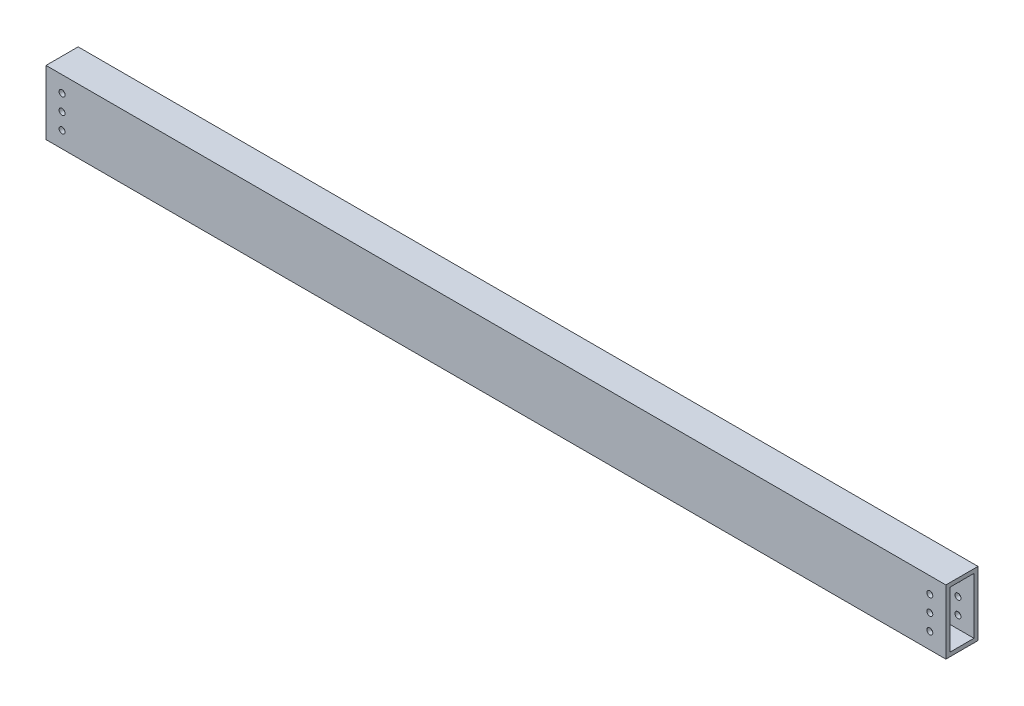
ISO-10303-21;
HEADER;
FILE_DESCRIPTION(('STEP AP214'),'2;1');
FILE_NAME('part.step','',(''),(''),'','','');
FILE_SCHEMA(('AUTOMOTIVE_DESIGN { 1 0 10303 214 1 1 1 1 }'));
ENDSEC;
DATA;
#1=APPLICATION_CONTEXT('core data for automotive mechanical design processes');
#2=APPLICATION_PROTOCOL_DEFINITION('international standard','automotive_design',2000,#1);
#3=PRODUCT_CONTEXT('',#1,'mechanical');
#4=PRODUCT('Part','Part','',(#3));
#5=PRODUCT_RELATED_PRODUCT_CATEGORY('part','',(#4));
#6=PRODUCT_DEFINITION_FORMATION('','',#4);
#7=PRODUCT_DEFINITION_CONTEXT('part definition',#1,'design');
#8=PRODUCT_DEFINITION('design','',#6,#7);
#9=PRODUCT_DEFINITION_SHAPE('','',#8);
#10=(LENGTH_UNIT() NAMED_UNIT(*) SI_UNIT(.MILLI.,.METRE.));
#11=(NAMED_UNIT(*) PLANE_ANGLE_UNIT() SI_UNIT($,.RADIAN.));
#12=(NAMED_UNIT(*) SI_UNIT($,.STERADIAN.) SOLID_ANGLE_UNIT());
#13=UNCERTAINTY_MEASURE_WITH_UNIT(LENGTH_MEASURE(1.E-05),#10,'distance_accuracy_value','');
#14=(GEOMETRIC_REPRESENTATION_CONTEXT(3) GLOBAL_UNCERTAINTY_ASSIGNED_CONTEXT((#13)) GLOBAL_UNIT_ASSIGNED_CONTEXT((#10,
#11,#12)) REPRESENTATION_CONTEXT('',''));
#15=CARTESIAN_POINT('',(0.,0.,0.));
#16=DIRECTION('',(0.,0.,1.));
#17=DIRECTION('',(1.,0.,0.));
#18=AXIS2_PLACEMENT_3D('',#15,#16,#17);
#19=CARTESIAN_POINT('',(355.6,25.4,-12.7));
#20=DIRECTION('',(0.,0.,1.));
#21=DIRECTION('',(1.,0.,0.));
#22=AXIS2_PLACEMENT_3D('',#19,#20,#21);
#23=PLANE('',#22);
#24=CARTESIAN_POINT('',(342.9,12.7,-12.7));
#25=DIRECTION('',(0.,0.,1.));
#26=DIRECTION('',(-1.,0.,0.));
#27=AXIS2_PLACEMENT_3D('',#24,#25,#26);
#28=CIRCLE('',#27,2.38125000000001);
#29=CARTESIAN_POINT('',(340.51875,12.7,-12.7));
#30=VERTEX_POINT('',#29);
#31=EDGE_CURVE('E226',#30,#30,#28,.T.);
#32=ORIENTED_EDGE('',*,*,#31,.T.);
#33=EDGE_LOOP('',(#32));
#34=FACE_BOUND('',#33,.T.);
#35=CARTESIAN_POINT('',(342.9,0.,-12.7));
#36=DIRECTION('',(0.,0.,1.));
#37=DIRECTION('',(-1.,0.,0.));
#38=AXIS2_PLACEMENT_3D('',#35,#36,#37);
#39=CIRCLE('',#38,2.38125000000001);
#40=CARTESIAN_POINT('',(340.51875,0.,-12.7));
#41=VERTEX_POINT('',#40);
#42=EDGE_CURVE('E230',#41,#41,#39,.T.);
#43=ORIENTED_EDGE('',*,*,#42,.T.);
#44=EDGE_LOOP('',(#43));
#45=FACE_BOUND('',#44,.T.);
#46=CARTESIAN_POINT('',(342.9,-12.7,-12.7));
#47=DIRECTION('',(0.,0.,1.));
#48=DIRECTION('',(-1.,0.,0.));
#49=AXIS2_PLACEMENT_3D('',#46,#47,#48);
#50=CIRCLE('',#49,2.38125000000001);
#51=CARTESIAN_POINT('',(340.51875,-12.7,-12.7));
#52=VERTEX_POINT('',#51);
#53=EDGE_CURVE('E234',#52,#52,#50,.T.);
#54=ORIENTED_EDGE('',*,*,#53,.T.);
#55=EDGE_LOOP('',(#54));
#56=FACE_BOUND('',#55,.T.);
#57=CARTESIAN_POINT('',(-342.9,-12.7,-12.7));
#58=DIRECTION('',(0.,0.,1.));
#59=DIRECTION('',(1.,0.,0.));
#60=AXIS2_PLACEMENT_3D('',#57,#58,#59);
#61=CIRCLE('',#60,2.38125000000001);
#62=CARTESIAN_POINT('',(-340.51875,-12.7,-12.7));
#63=VERTEX_POINT('',#62);
#64=EDGE_CURVE('E238',#63,#63,#61,.T.);
#65=ORIENTED_EDGE('',*,*,#64,.T.);
#66=EDGE_LOOP('',(#65));
#67=FACE_BOUND('',#66,.T.);
#68=CARTESIAN_POINT('',(-342.9,0.,-12.7));
#69=DIRECTION('',(0.,0.,1.));
#70=DIRECTION('',(1.,0.,0.));
#71=AXIS2_PLACEMENT_3D('',#68,#69,#70);
#72=CIRCLE('',#71,2.38125000000001);
#73=CARTESIAN_POINT('',(-340.51875,0.,-12.7));
#74=VERTEX_POINT('',#73);
#75=EDGE_CURVE('E242',#74,#74,#72,.T.);
#76=ORIENTED_EDGE('',*,*,#75,.T.);
#77=EDGE_LOOP('',(#76));
#78=FACE_BOUND('',#77,.T.);
#79=CARTESIAN_POINT('',(-342.9,12.7,-12.7));
#80=DIRECTION('',(0.,0.,1.));
#81=DIRECTION('',(1.,0.,0.));
#82=AXIS2_PLACEMENT_3D('',#79,#80,#81);
#83=CIRCLE('',#82,2.38125000000001);
#84=CARTESIAN_POINT('',(-340.51875,12.7,-12.7));
#85=VERTEX_POINT('',#84);
#86=EDGE_CURVE('E167',#85,#85,#83,.T.);
#87=ORIENTED_EDGE('',*,*,#86,.T.);
#88=EDGE_LOOP('',(#87));
#89=FACE_BOUND('',#88,.T.);
#90=DIRECTION('',(0.,1.,0.));
#91=VECTOR('',#90,1.);
#92=CARTESIAN_POINT('',(-355.6,25.4,-12.7));
#93=LINE('',#92,#91);
#94=CARTESIAN_POINT('',(-355.6,-25.4,-12.7));
#95=VERTEX_POINT('',#94);
#96=CARTESIAN_POINT('',(-355.6,25.4,-12.7));
#97=VERTEX_POINT('',#96);
#98=EDGE_CURVE('E148',#95,#97,#93,.T.);
#99=ORIENTED_EDGE('',*,*,#98,.T.);
#100=DIRECTION('',(-1.,0.,0.));
#101=VECTOR('',#100,1.);
#102=CARTESIAN_POINT('',(355.6,25.4,-12.7));
#103=LINE('',#102,#101);
#104=CARTESIAN_POINT('',(355.6,25.4,-12.7));
#105=VERTEX_POINT('',#104);
#106=EDGE_CURVE('E11',#105,#97,#103,.T.);
#107=ORIENTED_EDGE('',*,*,#106,.F.);
#108=DIRECTION('',(0.,1.,0.));
#109=VECTOR('',#108,1.);
#110=CARTESIAN_POINT('',(355.6,25.4,-12.7));
#111=LINE('',#110,#109);
#112=CARTESIAN_POINT('',(355.6,-25.4,-12.7));
#113=VERTEX_POINT('',#112);
#114=EDGE_CURVE('E137',#113,#105,#111,.T.);
#115=ORIENTED_EDGE('',*,*,#114,.F.);
#116=DIRECTION('',(-1.,0.,0.));
#117=VECTOR('',#116,1.);
#118=CARTESIAN_POINT('',(355.6,-25.4,-12.7));
#119=LINE('',#118,#117);
#120=EDGE_CURVE('E147',#113,#95,#119,.T.);
#121=ORIENTED_EDGE('',*,*,#120,.T.);
#122=EDGE_LOOP('',(#99,#107,#115,#121));
#123=FACE_BOUND('',#122,.T.);
#124=ADVANCED_FACE('F37',(#34,#45,#56,#67,#78,#89,#123),#23,.F.);
#125=CARTESIAN_POINT('',(355.6,25.4,12.7));
#126=DIRECTION('',(0.,-1.,0.));
#127=DIRECTION('',(0.,0.,-1.));
#128=AXIS2_PLACEMENT_3D('',#125,#126,#127);
#129=PLANE('',#128);
#130=DIRECTION('',(0.,0.,1.));
#131=VECTOR('',#130,1.);
#132=CARTESIAN_POINT('',(-355.6,25.4,12.7));
#133=LINE('',#132,#131);
#134=CARTESIAN_POINT('',(-355.6,25.4,12.7));
#135=VERTEX_POINT('',#134);
#136=EDGE_CURVE('E151',#97,#135,#133,.T.);
#137=ORIENTED_EDGE('',*,*,#136,.T.);
#138=DIRECTION('',(-1.,0.,0.));
#139=VECTOR('',#138,1.);
#140=CARTESIAN_POINT('',(355.6,25.4,12.7));
#141=LINE('',#140,#139);
#142=CARTESIAN_POINT('',(355.6,25.4,12.7));
#143=VERTEX_POINT('',#142);
#144=EDGE_CURVE('E45',#143,#135,#141,.T.);
#145=ORIENTED_EDGE('',*,*,#144,.F.);
#146=DIRECTION('',(0.,0.,1.));
#147=VECTOR('',#146,1.);
#148=CARTESIAN_POINT('',(355.6,25.4,12.7));
#149=LINE('',#148,#147);
#150=EDGE_CURVE('E140',#105,#143,#149,.T.);
#151=ORIENTED_EDGE('',*,*,#150,.F.);
#152=ORIENTED_EDGE('',*,*,#106,.T.);
#153=EDGE_LOOP('',(#137,#145,#151,#152));
#154=FACE_BOUND('',#153,.T.);
#155=ADVANCED_FACE('F216',(#154),#129,.F.);
#156=CARTESIAN_POINT('',(355.6,25.4,12.7));
#157=DIRECTION('',(0.,0.,-1.));
#158=DIRECTION('',(-1.,0.,0.));
#159=AXIS2_PLACEMENT_3D('',#156,#157,#158);
#160=PLANE('',#159);
#161=CARTESIAN_POINT('',(342.9,12.7,12.7));
#162=DIRECTION('',(0.,0.,1.));
#163=DIRECTION('',(-1.,0.,0.));
#164=AXIS2_PLACEMENT_3D('',#161,#162,#163);
#165=CIRCLE('',#164,2.38125000000001);
#166=CARTESIAN_POINT('',(340.51875,12.7,12.7));
#167=VERTEX_POINT('',#166);
#168=EDGE_CURVE('E334',#167,#167,#165,.T.);
#169=ORIENTED_EDGE('',*,*,#168,.F.);
#170=EDGE_LOOP('',(#169));
#171=FACE_BOUND('',#170,.T.);
#172=CARTESIAN_POINT('',(342.9,0.,12.7));
#173=DIRECTION('',(0.,0.,1.));
#174=DIRECTION('',(-1.,0.,0.));
#175=AXIS2_PLACEMENT_3D('',#172,#173,#174);
#176=CIRCLE('',#175,2.38125000000001);
#177=CARTESIAN_POINT('',(340.51875,0.,12.7));
#178=VERTEX_POINT('',#177);
#179=EDGE_CURVE('E331',#178,#178,#176,.T.);
#180=ORIENTED_EDGE('',*,*,#179,.F.);
#181=EDGE_LOOP('',(#180));
#182=FACE_BOUND('',#181,.T.);
#183=CARTESIAN_POINT('',(342.9,-12.7,12.7));
#184=DIRECTION('',(0.,0.,1.));
#185=DIRECTION('',(-1.,0.,0.));
#186=AXIS2_PLACEMENT_3D('',#183,#184,#185);
#187=CIRCLE('',#186,2.38125000000001);
#188=CARTESIAN_POINT('',(340.51875,-12.7,12.7));
#189=VERTEX_POINT('',#188);
#190=EDGE_CURVE('E327',#189,#189,#187,.T.);
#191=ORIENTED_EDGE('',*,*,#190,.F.);
#192=EDGE_LOOP('',(#191));
#193=FACE_BOUND('',#192,.T.);
#194=CARTESIAN_POINT('',(-342.9,-12.7,12.7));
#195=DIRECTION('',(0.,0.,1.));
#196=DIRECTION('',(1.,0.,0.));
#197=AXIS2_PLACEMENT_3D('',#194,#195,#196);
#198=CIRCLE('',#197,2.38125000000001);
#199=CARTESIAN_POINT('',(-340.51875,-12.7,12.7));
#200=VERTEX_POINT('',#199);
#201=EDGE_CURVE('E319',#200,#200,#198,.T.);
#202=ORIENTED_EDGE('',*,*,#201,.F.);
#203=EDGE_LOOP('',(#202));
#204=FACE_BOUND('',#203,.T.);
#205=CARTESIAN_POINT('',(-342.9,0.,12.7));
#206=DIRECTION('',(0.,0.,1.));
#207=DIRECTION('',(1.,0.,0.));
#208=AXIS2_PLACEMENT_3D('',#205,#206,#207);
#209=CIRCLE('',#208,2.38125000000001);
#210=CARTESIAN_POINT('',(-340.51875,0.,12.7));
#211=VERTEX_POINT('',#210);
#212=EDGE_CURVE('E309',#211,#211,#209,.T.);
#213=ORIENTED_EDGE('',*,*,#212,.F.);
#214=EDGE_LOOP('',(#213));
#215=FACE_BOUND('',#214,.T.);
#216=CARTESIAN_POINT('',(-342.9,12.7,12.7));
#217=DIRECTION('',(0.,0.,1.));
#218=DIRECTION('',(1.,0.,0.));
#219=AXIS2_PLACEMENT_3D('',#216,#217,#218);
#220=CIRCLE('',#219,2.38125000000001);
#221=CARTESIAN_POINT('',(-340.51875,12.7,12.7));
#222=VERTEX_POINT('',#221);
#223=EDGE_CURVE('E306',#222,#222,#220,.T.);
#224=ORIENTED_EDGE('',*,*,#223,.F.);
#225=EDGE_LOOP('',(#224));
#226=FACE_BOUND('',#225,.T.);
#227=DIRECTION('',(0.,-1.,0.));
#228=VECTOR('',#227,1.);
#229=CARTESIAN_POINT('',(-355.6,25.4,12.7));
#230=LINE('',#229,#228);
#231=CARTESIAN_POINT('',(-355.6,-25.4,12.7));
#232=VERTEX_POINT('',#231);
#233=EDGE_CURVE('E153',#135,#232,#230,.T.);
#234=ORIENTED_EDGE('',*,*,#233,.T.);
#235=DIRECTION('',(-1.,0.,0.));
#236=VECTOR('',#235,1.);
#237=CARTESIAN_POINT('',(355.6,-25.4,12.7));
#238=LINE('',#237,#236);
#239=CARTESIAN_POINT('',(355.6,-25.4,12.7));
#240=VERTEX_POINT('',#239);
#241=EDGE_CURVE('E158',#240,#232,#238,.T.);
#242=ORIENTED_EDGE('',*,*,#241,.F.);
#243=DIRECTION('',(0.,-1.,0.));
#244=VECTOR('',#243,1.);
#245=CARTESIAN_POINT('',(355.6,25.4,12.7));
#246=LINE('',#245,#244);
#247=EDGE_CURVE('E143',#143,#240,#246,.T.);
#248=ORIENTED_EDGE('',*,*,#247,.F.);
#249=ORIENTED_EDGE('',*,*,#144,.T.);
#250=EDGE_LOOP('',(#234,#242,#248,#249));
#251=FACE_BOUND('',#250,.T.);
#252=ADVANCED_FACE('F221',(#171,#182,#193,#204,#215,#226,#251),#160,.F.);
#253=CARTESIAN_POINT('',(355.6,-25.4,12.7));
#254=DIRECTION('',(0.,1.,0.));
#255=DIRECTION('',(0.,0.,1.));
#256=AXIS2_PLACEMENT_3D('',#253,#254,#255);
#257=PLANE('',#256);
#258=DIRECTION('',(0.,0.,-1.));
#259=VECTOR('',#258,1.);
#260=CARTESIAN_POINT('',(-355.6,-25.4,12.7));
#261=LINE('',#260,#259);
#262=EDGE_CURVE('E141',#232,#95,#261,.T.);
#263=ORIENTED_EDGE('',*,*,#262,.T.);
#264=ORIENTED_EDGE('',*,*,#120,.F.);
#265=DIRECTION('',(0.,0.,-1.));
#266=VECTOR('',#265,1.);
#267=CARTESIAN_POINT('',(355.6,-25.4,12.7));
#268=LINE('',#267,#266);
#269=EDGE_CURVE('E145',#240,#113,#268,.T.);
#270=ORIENTED_EDGE('',*,*,#269,.F.);
#271=ORIENTED_EDGE('',*,*,#241,.T.);
#272=EDGE_LOOP('',(#263,#264,#270,#271));
#273=FACE_BOUND('',#272,.T.);
#274=ADVANCED_FACE('F257',(#273),#257,.F.);
#275=CARTESIAN_POINT('',(355.6,0.,0.));
#276=DIRECTION('',(1.,0.,0.));
#277=DIRECTION('',(0.,0.,-1.));
#278=AXIS2_PLACEMENT_3D('',#275,#276,#277);
#279=PLANE('',#278);
#280=DIRECTION('',(0.,1.,0.));
#281=VECTOR('',#280,1.);
#282=CARTESIAN_POINT('',(355.6,25.4,-9.52500000000001));
#283=LINE('',#282,#281);
#284=CARTESIAN_POINT('',(355.6,-22.225,-9.52500000000001));
#285=VERTEX_POINT('',#284);
#286=CARTESIAN_POINT('',(355.6,22.225,-9.52500000000001));
#287=VERTEX_POINT('',#286);
#288=EDGE_CURVE('E125',#285,#287,#283,.T.);
#289=ORIENTED_EDGE('',*,*,#288,.F.);
#290=DIRECTION('',(0.,0.,-1.));
#291=VECTOR('',#290,1.);
#292=CARTESIAN_POINT('',(355.6,-22.225,12.7));
#293=LINE('',#292,#291);
#294=CARTESIAN_POINT('',(355.6,-22.225,9.52500000000001));
#295=VERTEX_POINT('',#294);
#296=EDGE_CURVE('E108',#295,#285,#293,.T.);
#297=ORIENTED_EDGE('',*,*,#296,.F.);
#298=DIRECTION('',(0.,-1.,0.));
#299=VECTOR('',#298,1.);
#300=CARTESIAN_POINT('',(355.6,25.4,9.52500000000001));
#301=LINE('',#300,#299);
#302=CARTESIAN_POINT('',(355.6,22.225,9.52500000000001));
#303=VERTEX_POINT('',#302);
#304=EDGE_CURVE('E134',#303,#295,#301,.T.);
#305=ORIENTED_EDGE('',*,*,#304,.F.);
#306=DIRECTION('',(0.,0.,1.));
#307=VECTOR('',#306,1.);
#308=CARTESIAN_POINT('',(355.6,22.225,12.7));
#309=LINE('',#308,#307);
#310=EDGE_CURVE('E127',#287,#303,#309,.T.);
#311=ORIENTED_EDGE('',*,*,#310,.F.);
#312=EDGE_LOOP('',(#289,#297,#305,#311));
#313=FACE_BOUND('',#312,.T.);
#314=ORIENTED_EDGE('',*,*,#114,.T.);
#315=ORIENTED_EDGE('',*,*,#150,.T.);
#316=ORIENTED_EDGE('',*,*,#247,.T.);
#317=ORIENTED_EDGE('',*,*,#269,.T.);
#318=EDGE_LOOP('',(#314,#315,#316,#317));
#319=FACE_BOUND('',#318,.T.);
#320=ADVANCED_FACE('F201',(#313,#319),#279,.T.);
#321=CARTESIAN_POINT('',(-355.6,0.,0.));
#322=DIRECTION('',(1.,0.,0.));
#323=DIRECTION('',(0.,0.,-1.));
#324=AXIS2_PLACEMENT_3D('',#321,#322,#323);
#325=PLANE('',#324);
#326=DIRECTION('',(0.,0.,-1.));
#327=VECTOR('',#326,1.);
#328=CARTESIAN_POINT('',(-355.6,-22.225,12.7));
#329=LINE('',#328,#327);
#330=CARTESIAN_POINT('',(-355.6,-22.225,9.52500000000001));
#331=VERTEX_POINT('',#330);
#332=CARTESIAN_POINT('',(-355.6,-22.225,-9.52500000000001));
#333=VERTEX_POINT('',#332);
#334=EDGE_CURVE('E106',#331,#333,#329,.T.);
#335=ORIENTED_EDGE('',*,*,#334,.T.);
#336=DIRECTION('',(0.,1.,0.));
#337=VECTOR('',#336,1.);
#338=CARTESIAN_POINT('',(-355.6,25.4,-9.52500000000001));
#339=LINE('',#338,#337);
#340=CARTESIAN_POINT('',(-355.6,22.225,-9.52500000000001));
#341=VERTEX_POINT('',#340);
#342=EDGE_CURVE('E114',#333,#341,#339,.T.);
#343=ORIENTED_EDGE('',*,*,#342,.T.);
#344=DIRECTION('',(0.,0.,1.));
#345=VECTOR('',#344,1.);
#346=CARTESIAN_POINT('',(-355.6,22.225,12.7));
#347=LINE('',#346,#345);
#348=CARTESIAN_POINT('',(-355.6,22.225,9.52500000000001));
#349=VERTEX_POINT('',#348);
#350=EDGE_CURVE('E120',#341,#349,#347,.T.);
#351=ORIENTED_EDGE('',*,*,#350,.T.);
#352=DIRECTION('',(0.,-1.,0.));
#353=VECTOR('',#352,1.);
#354=CARTESIAN_POINT('',(-355.6,25.4,9.52500000000001));
#355=LINE('',#354,#353);
#356=EDGE_CURVE('E60',#349,#331,#355,.T.);
#357=ORIENTED_EDGE('',*,*,#356,.T.);
#358=EDGE_LOOP('',(#335,#343,#351,#357));
#359=FACE_BOUND('',#358,.T.);
#360=ORIENTED_EDGE('',*,*,#98,.F.);
#361=ORIENTED_EDGE('',*,*,#262,.F.);
#362=ORIENTED_EDGE('',*,*,#233,.F.);
#363=ORIENTED_EDGE('',*,*,#136,.F.);
#364=EDGE_LOOP('',(#360,#361,#362,#363));
#365=FACE_BOUND('',#364,.T.);
#366=ADVANCED_FACE('F123',(#359,#365),#325,.F.);
#367=CARTESIAN_POINT('',(355.6,25.4,-9.52500000000001));
#368=DIRECTION('',(0.,0.,1.));
#369=DIRECTION('',(1.,0.,0.));
#370=AXIS2_PLACEMENT_3D('',#367,#368,#369);
#371=PLANE('',#370);
#372=CARTESIAN_POINT('',(342.9,12.7,-9.52500000000001));
#373=DIRECTION('',(0.,0.,1.));
#374=DIRECTION('',(1.,0.,0.));
#375=AXIS2_PLACEMENT_3D('',#372,#373,#374);
#376=CIRCLE('',#375,2.38125000000001);
#377=CARTESIAN_POINT('',(345.28125,12.7,-9.52500000000001));
#378=VERTEX_POINT('',#377);
#379=EDGE_CURVE('E121',#378,#378,#376,.T.);
#380=ORIENTED_EDGE('',*,*,#379,.F.);
#381=EDGE_LOOP('',(#380));
#382=FACE_BOUND('',#381,.T.);
#383=CARTESIAN_POINT('',(342.9,0.,-9.52500000000001));
#384=DIRECTION('',(0.,0.,1.));
#385=DIRECTION('',(1.,0.,0.));
#386=AXIS2_PLACEMENT_3D('',#383,#384,#385);
#387=CIRCLE('',#386,2.38125000000001);
#388=CARTESIAN_POINT('',(345.28125,0.,-9.52500000000001));
#389=VERTEX_POINT('',#388);
#390=EDGE_CURVE('E181',#389,#389,#387,.T.);
#391=ORIENTED_EDGE('',*,*,#390,.F.);
#392=EDGE_LOOP('',(#391));
#393=FACE_BOUND('',#392,.T.);
#394=CARTESIAN_POINT('',(342.9,-12.7,-9.52500000000001));
#395=DIRECTION('',(0.,0.,1.));
#396=DIRECTION('',(1.,0.,0.));
#397=AXIS2_PLACEMENT_3D('',#394,#395,#396);
#398=CIRCLE('',#397,2.38125000000001);
#399=CARTESIAN_POINT('',(345.28125,-12.7,-9.52500000000001));
#400=VERTEX_POINT('',#399);
#401=EDGE_CURVE('E178',#400,#400,#398,.T.);
#402=ORIENTED_EDGE('',*,*,#401,.F.);
#403=EDGE_LOOP('',(#402));
#404=FACE_BOUND('',#403,.T.);
#405=CARTESIAN_POINT('',(-342.9,-12.7,-9.52500000000001));
#406=DIRECTION('',(0.,0.,1.));
#407=DIRECTION('',(1.,0.,0.));
#408=AXIS2_PLACEMENT_3D('',#405,#406,#407);
#409=CIRCLE('',#408,2.38125000000001);
#410=CARTESIAN_POINT('',(-340.51875,-12.7,-9.52500000000001));
#411=VERTEX_POINT('',#410);
#412=EDGE_CURVE('E175',#411,#411,#409,.T.);
#413=ORIENTED_EDGE('',*,*,#412,.F.);
#414=EDGE_LOOP('',(#413));
#415=FACE_BOUND('',#414,.T.);
#416=CARTESIAN_POINT('',(-342.9,0.,-9.52500000000001));
#417=DIRECTION('',(0.,0.,1.));
#418=DIRECTION('',(1.,0.,0.));
#419=AXIS2_PLACEMENT_3D('',#416,#417,#418);
#420=CIRCLE('',#419,2.38125000000001);
#421=CARTESIAN_POINT('',(-340.51875,0.,-9.52500000000001));
#422=VERTEX_POINT('',#421);
#423=EDGE_CURVE('E171',#422,#422,#420,.T.);
#424=ORIENTED_EDGE('',*,*,#423,.F.);
#425=EDGE_LOOP('',(#424));
#426=FACE_BOUND('',#425,.T.);
#427=CARTESIAN_POINT('',(-342.9,12.7,-9.52500000000001));
#428=DIRECTION('',(0.,0.,1.));
#429=DIRECTION('',(1.,0.,0.));
#430=AXIS2_PLACEMENT_3D('',#427,#428,#429);
#431=CIRCLE('',#430,2.38125000000001);
#432=CARTESIAN_POINT('',(-340.51875,12.7,-9.52500000000001));
#433=VERTEX_POINT('',#432);
#434=EDGE_CURVE('E166',#433,#433,#431,.T.);
#435=ORIENTED_EDGE('',*,*,#434,.F.);
#436=EDGE_LOOP('',(#435));
#437=FACE_BOUND('',#436,.T.);
#438=ORIENTED_EDGE('',*,*,#342,.F.);
#439=DIRECTION('',(-1.,0.,0.));
#440=VECTOR('',#439,1.);
#441=CARTESIAN_POINT('',(355.6,-22.225,-9.52500000000001));
#442=LINE('',#441,#440);
#443=EDGE_CURVE('E102',#285,#333,#442,.T.);
#444=ORIENTED_EDGE('',*,*,#443,.F.);
#445=ORIENTED_EDGE('',*,*,#288,.T.);
#446=DIRECTION('',(-1.,0.,0.));
#447=VECTOR('',#446,1.);
#448=CARTESIAN_POINT('',(355.6,22.225,-9.52500000000001));
#449=LINE('',#448,#447);
#450=EDGE_CURVE('E117',#287,#341,#449,.T.);
#451=ORIENTED_EDGE('',*,*,#450,.T.);
#452=EDGE_LOOP('',(#438,#444,#445,#451));
#453=FACE_BOUND('',#452,.T.);
#454=ADVANCED_FACE('F115',(#382,#393,#404,#415,#426,#437,#453),#371,.T.);
#455=CARTESIAN_POINT('',(355.6,22.225,12.7));
#456=DIRECTION('',(0.,-1.,0.));
#457=DIRECTION('',(0.,0.,-1.));
#458=AXIS2_PLACEMENT_3D('',#455,#456,#457);
#459=PLANE('',#458);
#460=ORIENTED_EDGE('',*,*,#350,.F.);
#461=ORIENTED_EDGE('',*,*,#450,.F.);
#462=ORIENTED_EDGE('',*,*,#310,.T.);
#463=DIRECTION('',(-1.,0.,0.));
#464=VECTOR('',#463,1.);
#465=CARTESIAN_POINT('',(355.6,22.225,9.52500000000001));
#466=LINE('',#465,#464);
#467=EDGE_CURVE('E195',#303,#349,#466,.T.);
#468=ORIENTED_EDGE('',*,*,#467,.T.);
#469=EDGE_LOOP('',(#460,#461,#462,#468));
#470=FACE_BOUND('',#469,.T.);
#471=ADVANCED_FACE('F204',(#470),#459,.T.);
#472=CARTESIAN_POINT('',(355.6,25.4,9.52500000000001));
#473=DIRECTION('',(0.,0.,-1.));
#474=DIRECTION('',(-1.,0.,0.));
#475=AXIS2_PLACEMENT_3D('',#472,#473,#474);
#476=PLANE('',#475);
#477=CARTESIAN_POINT('',(342.9,12.7,9.52500000000001));
#478=DIRECTION('',(0.,0.,-1.));
#479=DIRECTION('',(-1.,0.,0.));
#480=AXIS2_PLACEMENT_3D('',#477,#478,#479);
#481=CIRCLE('',#480,2.38125000000001);
#482=CARTESIAN_POINT('',(340.51875,12.7,9.52500000000001));
#483=VERTEX_POINT('',#482);
#484=EDGE_CURVE('E40',#483,#483,#481,.T.);
#485=ORIENTED_EDGE('',*,*,#484,.F.);
#486=EDGE_LOOP('',(#485));
#487=FACE_BOUND('',#486,.T.);
#488=CARTESIAN_POINT('',(342.9,0.,9.52500000000001));
#489=DIRECTION('',(0.,0.,-1.));
#490=DIRECTION('',(-1.,0.,0.));
#491=AXIS2_PLACEMENT_3D('',#488,#489,#490);
#492=CIRCLE('',#491,2.38125000000001);
#493=CARTESIAN_POINT('',(340.51875,0.,9.52500000000001));
#494=VERTEX_POINT('',#493);
#495=EDGE_CURVE('E179',#494,#494,#492,.T.);
#496=ORIENTED_EDGE('',*,*,#495,.F.);
#497=EDGE_LOOP('',(#496));
#498=FACE_BOUND('',#497,.T.);
#499=CARTESIAN_POINT('',(342.9,-12.7,9.52500000000001));
#500=DIRECTION('',(0.,0.,-1.));
#501=DIRECTION('',(-1.,0.,0.));
#502=AXIS2_PLACEMENT_3D('',#499,#500,#501);
#503=CIRCLE('',#502,2.38125000000001);
#504=CARTESIAN_POINT('',(340.51875,-12.7,9.52500000000001));
#505=VERTEX_POINT('',#504);
#506=EDGE_CURVE('E176',#505,#505,#503,.T.);
#507=ORIENTED_EDGE('',*,*,#506,.F.);
#508=EDGE_LOOP('',(#507));
#509=FACE_BOUND('',#508,.T.);
#510=CARTESIAN_POINT('',(-342.9,-12.7,9.52500000000001));
#511=DIRECTION('',(0.,0.,-1.));
#512=DIRECTION('',(-1.,0.,0.));
#513=AXIS2_PLACEMENT_3D('',#510,#511,#512);
#514=CIRCLE('',#513,2.38125000000001);
#515=CARTESIAN_POINT('',(-345.28125,-12.7,9.52500000000001));
#516=VERTEX_POINT('',#515);
#517=EDGE_CURVE('E172',#516,#516,#514,.T.);
#518=ORIENTED_EDGE('',*,*,#517,.F.);
#519=EDGE_LOOP('',(#518));
#520=FACE_BOUND('',#519,.T.);
#521=CARTESIAN_POINT('',(-342.9,0.,9.52500000000001));
#522=DIRECTION('',(0.,0.,-1.));
#523=DIRECTION('',(-1.,0.,0.));
#524=AXIS2_PLACEMENT_3D('',#521,#522,#523);
#525=CIRCLE('',#524,2.38125000000001);
#526=CARTESIAN_POINT('',(-345.28125,0.,9.52500000000001));
#527=VERTEX_POINT('',#526);
#528=EDGE_CURVE('E168',#527,#527,#525,.T.);
#529=ORIENTED_EDGE('',*,*,#528,.F.);
#530=EDGE_LOOP('',(#529));
#531=FACE_BOUND('',#530,.T.);
#532=CARTESIAN_POINT('',(-342.9,12.7,9.52500000000001));
#533=DIRECTION('',(0.,0.,-1.));
#534=DIRECTION('',(-1.,0.,0.));
#535=AXIS2_PLACEMENT_3D('',#532,#533,#534);
#536=CIRCLE('',#535,2.38125000000001);
#537=CARTESIAN_POINT('',(-345.28125,12.7,9.52500000000001));
#538=VERTEX_POINT('',#537);
#539=EDGE_CURVE('E163',#538,#538,#536,.T.);
#540=ORIENTED_EDGE('',*,*,#539,.F.);
#541=EDGE_LOOP('',(#540));
#542=FACE_BOUND('',#541,.T.);
#543=ORIENTED_EDGE('',*,*,#356,.F.);
#544=ORIENTED_EDGE('',*,*,#467,.F.);
#545=ORIENTED_EDGE('',*,*,#304,.T.);
#546=DIRECTION('',(-1.,0.,0.));
#547=VECTOR('',#546,1.);
#548=CARTESIAN_POINT('',(355.6,-22.225,9.52500000000001));
#549=LINE('',#548,#547);
#550=EDGE_CURVE('E53',#295,#331,#549,.T.);
#551=ORIENTED_EDGE('',*,*,#550,.T.);
#552=EDGE_LOOP('',(#543,#544,#545,#551));
#553=FACE_BOUND('',#552,.T.);
#554=ADVANCED_FACE('F197',(#487,#498,#509,#520,#531,#542,#553),#476,.T.);
#555=CARTESIAN_POINT('',(355.6,-22.225,12.7));
#556=DIRECTION('',(0.,1.,0.));
#557=DIRECTION('',(0.,0.,1.));
#558=AXIS2_PLACEMENT_3D('',#555,#556,#557);
#559=PLANE('',#558);
#560=ORIENTED_EDGE('',*,*,#334,.F.);
#561=ORIENTED_EDGE('',*,*,#550,.F.);
#562=ORIENTED_EDGE('',*,*,#296,.T.);
#563=ORIENTED_EDGE('',*,*,#443,.T.);
#564=EDGE_LOOP('',(#560,#561,#562,#563));
#565=FACE_BOUND('',#564,.T.);
#566=ADVANCED_FACE('F104',(#565),#559,.T.);
#567=CARTESIAN_POINT('',(-342.9,12.7,-12.7));
#568=DIRECTION('',(0.,0.,1.));
#569=DIRECTION('',(1.,0.,0.));
#570=AXIS2_PLACEMENT_3D('',#567,#568,#569);
#571=CYLINDRICAL_SURFACE('',#570,2.38125000000001);
#572=ORIENTED_EDGE('',*,*,#539,.T.);
#573=EDGE_LOOP('',(#572));
#574=FACE_BOUND('',#573,.T.);
#575=ORIENTED_EDGE('',*,*,#223,.T.);
#576=EDGE_LOOP('',(#575));
#577=FACE_BOUND('',#576,.T.);
#578=ADVANCED_FACE('F274',(#574,#577),#571,.F.);
#579=CARTESIAN_POINT('',(-342.9,0.,-12.7));
#580=DIRECTION('',(0.,0.,1.));
#581=DIRECTION('',(1.,0.,0.));
#582=AXIS2_PLACEMENT_3D('',#579,#580,#581);
#583=CYLINDRICAL_SURFACE('',#582,2.38125000000001);
#584=ORIENTED_EDGE('',*,*,#528,.T.);
#585=EDGE_LOOP('',(#584));
#586=FACE_BOUND('',#585,.T.);
#587=ORIENTED_EDGE('',*,*,#212,.T.);
#588=EDGE_LOOP('',(#587));
#589=FACE_BOUND('',#588,.T.);
#590=ADVANCED_FACE('F278',(#586,#589),#583,.F.);
#591=CARTESIAN_POINT('',(-342.9,-12.7,-12.7));
#592=DIRECTION('',(0.,0.,1.));
#593=DIRECTION('',(1.,0.,0.));
#594=AXIS2_PLACEMENT_3D('',#591,#592,#593);
#595=CYLINDRICAL_SURFACE('',#594,2.38125000000001);
#596=ORIENTED_EDGE('',*,*,#517,.T.);
#597=EDGE_LOOP('',(#596));
#598=FACE_BOUND('',#597,.T.);
#599=ORIENTED_EDGE('',*,*,#201,.T.);
#600=EDGE_LOOP('',(#599));
#601=FACE_BOUND('',#600,.T.);
#602=ADVANCED_FACE('F285',(#598,#601),#595,.F.);
#603=CARTESIAN_POINT('',(342.9,-12.7,-12.7));
#604=DIRECTION('',(0.,0.,1.));
#605=DIRECTION('',(1.,0.,0.));
#606=AXIS2_PLACEMENT_3D('',#603,#604,#605);
#607=CYLINDRICAL_SURFACE('',#606,2.38125000000001);
#608=ORIENTED_EDGE('',*,*,#506,.T.);
#609=EDGE_LOOP('',(#608));
#610=FACE_BOUND('',#609,.T.);
#611=ORIENTED_EDGE('',*,*,#190,.T.);
#612=EDGE_LOOP('',(#611));
#613=FACE_BOUND('',#612,.T.);
#614=ADVANCED_FACE('F350',(#610,#613),#607,.F.);
#615=CARTESIAN_POINT('',(342.9,0.,-12.7));
#616=DIRECTION('',(0.,0.,1.));
#617=DIRECTION('',(1.,0.,0.));
#618=AXIS2_PLACEMENT_3D('',#615,#616,#617);
#619=CYLINDRICAL_SURFACE('',#618,2.38125000000001);
#620=ORIENTED_EDGE('',*,*,#495,.T.);
#621=EDGE_LOOP('',(#620));
#622=FACE_BOUND('',#621,.T.);
#623=ORIENTED_EDGE('',*,*,#179,.T.);
#624=EDGE_LOOP('',(#623));
#625=FACE_BOUND('',#624,.T.);
#626=ADVANCED_FACE('F300',(#622,#625),#619,.F.);
#627=CARTESIAN_POINT('',(342.9,12.7,-12.7));
#628=DIRECTION('',(0.,0.,1.));
#629=DIRECTION('',(1.,0.,0.));
#630=AXIS2_PLACEMENT_3D('',#627,#628,#629);
#631=CYLINDRICAL_SURFACE('',#630,2.38125000000001);
#632=ORIENTED_EDGE('',*,*,#484,.T.);
#633=EDGE_LOOP('',(#632));
#634=FACE_BOUND('',#633,.T.);
#635=ORIENTED_EDGE('',*,*,#168,.T.);
#636=EDGE_LOOP('',(#635));
#637=FACE_BOUND('',#636,.T.);
#638=ADVANCED_FACE('F292',(#634,#637),#631,.F.);
#639=ORIENTED_EDGE('',*,*,#434,.T.);
#640=EDGE_LOOP('',(#639));
#641=FACE_BOUND('',#640,.T.);
#642=ORIENTED_EDGE('',*,*,#86,.F.);
#643=EDGE_LOOP('',(#642));
#644=FACE_BOUND('',#643,.T.);
#645=ADVANCED_FACE('F281',(#641,#644),#571,.F.);
#646=ORIENTED_EDGE('',*,*,#423,.T.);
#647=EDGE_LOOP('',(#646));
#648=FACE_BOUND('',#647,.T.);
#649=ORIENTED_EDGE('',*,*,#75,.F.);
#650=EDGE_LOOP('',(#649));
#651=FACE_BOUND('',#650,.T.);
#652=ADVANCED_FACE('F288',(#648,#651),#583,.F.);
#653=ORIENTED_EDGE('',*,*,#412,.T.);
#654=EDGE_LOOP('',(#653));
#655=FACE_BOUND('',#654,.T.);
#656=ORIENTED_EDGE('',*,*,#64,.F.);
#657=EDGE_LOOP('',(#656));
#658=FACE_BOUND('',#657,.T.);
#659=ADVANCED_FACE('F298',(#655,#658),#595,.F.);
#660=ORIENTED_EDGE('',*,*,#401,.T.);
#661=EDGE_LOOP('',(#660));
#662=FACE_BOUND('',#661,.T.);
#663=ORIENTED_EDGE('',*,*,#53,.F.);
#664=EDGE_LOOP('',(#663));
#665=FACE_BOUND('',#664,.T.);
#666=ADVANCED_FACE('F358',(#662,#665),#607,.F.);
#667=ORIENTED_EDGE('',*,*,#390,.T.);
#668=EDGE_LOOP('',(#667));
#669=FACE_BOUND('',#668,.T.);
#670=ORIENTED_EDGE('',*,*,#42,.F.);
#671=EDGE_LOOP('',(#670));
#672=FACE_BOUND('',#671,.T.);
#673=ADVANCED_FACE('F364',(#669,#672),#619,.F.);
#674=ORIENTED_EDGE('',*,*,#379,.T.);
#675=EDGE_LOOP('',(#674));
#676=FACE_BOUND('',#675,.T.);
#677=ORIENTED_EDGE('',*,*,#31,.F.);
#678=EDGE_LOOP('',(#677));
#679=FACE_BOUND('',#678,.T.);
#680=ADVANCED_FACE('F302',(#676,#679),#631,.F.);
#681=CLOSED_SHELL('',(#124,#155,#252,#274,#320,#366,#454,#471,#554,#566,#578,#590,#602,#614,
#626,#638,#645,#652,#659,#666,#673,#680));
#682=MANIFOLD_SOLID_BREP('B2',#681);
#683=ADVANCED_BREP_SHAPE_REPRESENTATION('',(#18,#682),#14);
#684=SHAPE_DEFINITION_REPRESENTATION(#9,#683);
ENDSEC;
END-ISO-10303-21;
